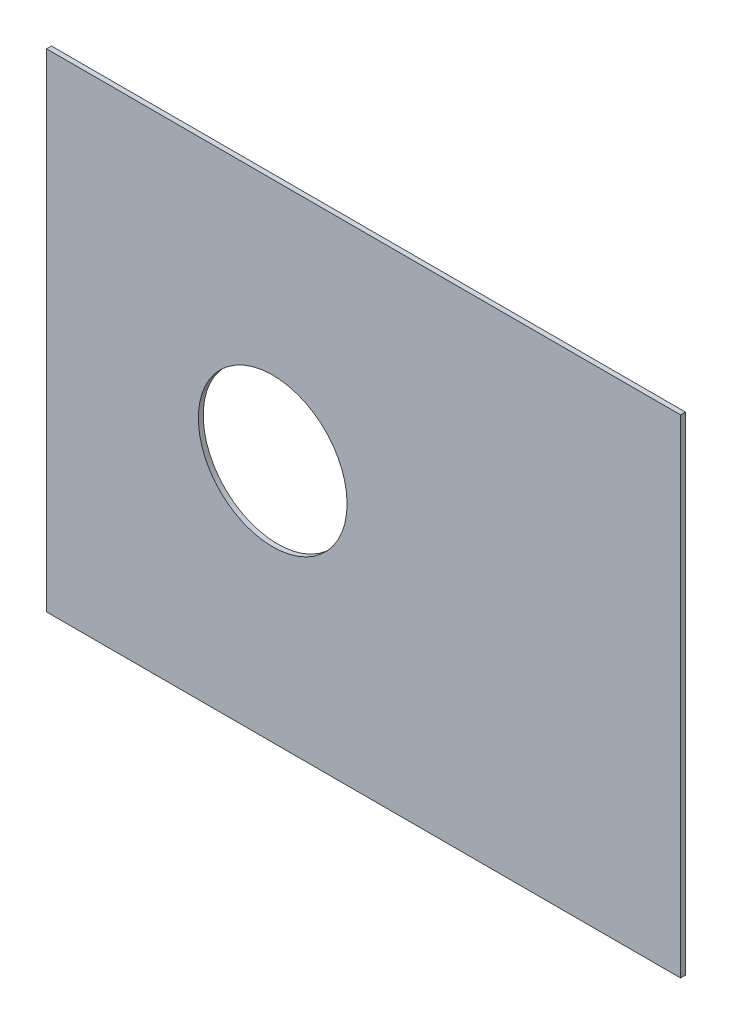
ISO-10303-21;
HEADER;
FILE_DESCRIPTION(('STEP AP214'),'2;1');
FILE_NAME('part.step','',(''),(''),'','','');
FILE_SCHEMA(('AUTOMOTIVE_DESIGN { 1 0 10303 214 1 1 1 1 }'));
ENDSEC;
DATA;
#1=APPLICATION_CONTEXT('core data for automotive mechanical design processes');
#2=APPLICATION_PROTOCOL_DEFINITION('international standard','automotive_design',2000,#1);
#3=PRODUCT_CONTEXT('',#1,'mechanical');
#4=PRODUCT('Part','Part','',(#3));
#5=PRODUCT_RELATED_PRODUCT_CATEGORY('part','',(#4));
#6=PRODUCT_DEFINITION_FORMATION('','',#4);
#7=PRODUCT_DEFINITION_CONTEXT('part definition',#1,'design');
#8=PRODUCT_DEFINITION('design','',#6,#7);
#9=PRODUCT_DEFINITION_SHAPE('','',#8);
#10=(LENGTH_UNIT() NAMED_UNIT(*) SI_UNIT(.MILLI.,.METRE.));
#11=(NAMED_UNIT(*) PLANE_ANGLE_UNIT() SI_UNIT($,.RADIAN.));
#12=(NAMED_UNIT(*) SI_UNIT($,.STERADIAN.) SOLID_ANGLE_UNIT());
#13=UNCERTAINTY_MEASURE_WITH_UNIT(LENGTH_MEASURE(1.E-05),#10,'distance_accuracy_value','');
#14=(GEOMETRIC_REPRESENTATION_CONTEXT(3) GLOBAL_UNCERTAINTY_ASSIGNED_CONTEXT((#13)) GLOBAL_UNIT_ASSIGNED_CONTEXT((#10,
#11,#12)) REPRESENTATION_CONTEXT('',''));
#15=CARTESIAN_POINT('',(0.,0.,0.));
#16=DIRECTION('',(0.,0.,1.));
#17=DIRECTION('',(1.,0.,0.));
#18=AXIS2_PLACEMENT_3D('',#15,#16,#17);
#19=CARTESIAN_POINT('',(0.,0.,2.));
#20=DIRECTION('',(0.,0.,-1.));
#21=DIRECTION('',(-1.,0.,0.));
#22=AXIS2_PLACEMENT_3D('',#19,#20,#21);
#23=PLANE('',#22);
#24=DIRECTION('',(0.,-1.,0.));
#25=VECTOR('',#24,1.);
#26=CARTESIAN_POINT('',(-130.,100.,2.));
#27=LINE('',#26,#25);
#28=CARTESIAN_POINT('',(-130.,100.,2.));
#29=VERTEX_POINT('',#28);
#30=CARTESIAN_POINT('',(-130.,-100.,2.));
#31=VERTEX_POINT('',#30);
#32=EDGE_CURVE('E92',#29,#31,#27,.T.);
#33=ORIENTED_EDGE('',*,*,#32,.T.);
#34=DIRECTION('',(1.,0.,0.));
#35=VECTOR('',#34,1.);
#36=CARTESIAN_POINT('',(130.,-100.,2.));
#37=LINE('',#36,#35);
#38=CARTESIAN_POINT('',(130.,-100.,2.));
#39=VERTEX_POINT('',#38);
#40=EDGE_CURVE('E87',#31,#39,#37,.T.);
#41=ORIENTED_EDGE('',*,*,#40,.T.);
#42=DIRECTION('',(0.,1.,0.));
#43=VECTOR('',#42,1.);
#44=CARTESIAN_POINT('',(130.,100.,2.));
#45=LINE('',#44,#43);
#46=CARTESIAN_POINT('',(130.,100.,2.));
#47=VERTEX_POINT('',#46);
#48=EDGE_CURVE('E90',#39,#47,#45,.T.);
#49=ORIENTED_EDGE('',*,*,#48,.T.);
#50=DIRECTION('',(-1.,0.,0.));
#51=VECTOR('',#50,1.);
#52=CARTESIAN_POINT('',(130.,100.,2.));
#53=LINE('',#52,#51);
#54=EDGE_CURVE('E57',#47,#29,#53,.T.);
#55=ORIENTED_EDGE('',*,*,#54,.T.);
#56=EDGE_LOOP('',(#33,#41,#49,#55));
#57=FACE_BOUND('',#56,.T.);
#58=CARTESIAN_POINT('',(-37.2600000000001,0.,2.));
#59=DIRECTION('',(0.,0.,1.));
#60=DIRECTION('',(1.,0.,0.));
#61=AXIS2_PLACEMENT_3D('',#58,#59,#60);
#62=CIRCLE('',#61,30.5);
#63=CARTESIAN_POINT('',(-6.76000000000006,0.,2.));
#64=VERTEX_POINT('',#63);
#65=EDGE_CURVE('E107',#64,#64,#62,.T.);
#66=ORIENTED_EDGE('',*,*,#65,.F.);
#67=EDGE_LOOP('',(#66));
#68=FACE_BOUND('',#67,.T.);
#69=ADVANCED_FACE('F40',(#57,#68),#23,.F.);
#70=CARTESIAN_POINT('',(0.,0.,0.));
#71=DIRECTION('',(0.,0.,-1.));
#72=DIRECTION('',(-1.,0.,0.));
#73=AXIS2_PLACEMENT_3D('',#70,#71,#72);
#74=PLANE('',#73);
#75=DIRECTION('',(0.,-1.,0.));
#76=VECTOR('',#75,1.);
#77=CARTESIAN_POINT('',(-130.,100.,0.));
#78=LINE('',#77,#76);
#79=CARTESIAN_POINT('',(-130.,100.,0.));
#80=VERTEX_POINT('',#79);
#81=CARTESIAN_POINT('',(-130.,-100.,0.));
#82=VERTEX_POINT('',#81);
#83=EDGE_CURVE('E104',#80,#82,#78,.T.);
#84=ORIENTED_EDGE('',*,*,#83,.F.);
#85=DIRECTION('',(-1.,0.,0.));
#86=VECTOR('',#85,1.);
#87=CARTESIAN_POINT('',(130.,100.,0.));
#88=LINE('',#87,#86);
#89=CARTESIAN_POINT('',(130.,100.,0.));
#90=VERTEX_POINT('',#89);
#91=EDGE_CURVE('E80',#90,#80,#88,.T.);
#92=ORIENTED_EDGE('',*,*,#91,.F.);
#93=DIRECTION('',(0.,1.,0.));
#94=VECTOR('',#93,1.);
#95=CARTESIAN_POINT('',(130.,100.,0.));
#96=LINE('',#95,#94);
#97=CARTESIAN_POINT('',(130.,-100.,0.));
#98=VERTEX_POINT('',#97);
#99=EDGE_CURVE('E74',#98,#90,#96,.T.);
#100=ORIENTED_EDGE('',*,*,#99,.F.);
#101=DIRECTION('',(1.,0.,0.));
#102=VECTOR('',#101,1.);
#103=CARTESIAN_POINT('',(130.,-100.,0.));
#104=LINE('',#103,#102);
#105=EDGE_CURVE('E96',#82,#98,#104,.T.);
#106=ORIENTED_EDGE('',*,*,#105,.F.);
#107=EDGE_LOOP('',(#84,#92,#100,#106));
#108=FACE_BOUND('',#107,.T.);
#109=CARTESIAN_POINT('',(-37.2600000000001,0.,0.));
#110=DIRECTION('',(0.,0.,1.));
#111=DIRECTION('',(1.,0.,0.));
#112=AXIS2_PLACEMENT_3D('',#109,#110,#111);
#113=CIRCLE('',#112,30.5);
#114=CARTESIAN_POINT('',(-6.76000000000006,0.,0.));
#115=VERTEX_POINT('',#114);
#116=EDGE_CURVE('E119',#115,#115,#113,.T.);
#117=ORIENTED_EDGE('',*,*,#116,.T.);
#118=EDGE_LOOP('',(#117));
#119=FACE_BOUND('',#118,.T.);
#120=ADVANCED_FACE('F115',(#108,#119),#74,.T.);
#121=CARTESIAN_POINT('',(-130.,100.,2.));
#122=DIRECTION('',(1.,0.,0.));
#123=DIRECTION('',(0.,1.,0.));
#124=AXIS2_PLACEMENT_3D('',#121,#122,#123);
#125=PLANE('',#124);
#126=ORIENTED_EDGE('',*,*,#83,.T.);
#127=DIRECTION('',(0.,0.,-1.));
#128=VECTOR('',#127,1.);
#129=CARTESIAN_POINT('',(-130.,-100.,2.));
#130=LINE('',#129,#128);
#131=EDGE_CURVE('E11',#31,#82,#130,.T.);
#132=ORIENTED_EDGE('',*,*,#131,.F.);
#133=ORIENTED_EDGE('',*,*,#32,.F.);
#134=DIRECTION('',(0.,0.,-1.));
#135=VECTOR('',#134,1.);
#136=CARTESIAN_POINT('',(-130.,100.,2.));
#137=LINE('',#136,#135);
#138=EDGE_CURVE('E100',#29,#80,#137,.T.);
#139=ORIENTED_EDGE('',*,*,#138,.T.);
#140=EDGE_LOOP('',(#126,#132,#133,#139));
#141=FACE_BOUND('',#140,.T.);
#142=ADVANCED_FACE('F42',(#141),#125,.F.);
#143=CARTESIAN_POINT('',(130.,-100.,2.));
#144=DIRECTION('',(0.,1.,0.));
#145=DIRECTION('',(-1.,0.,0.));
#146=AXIS2_PLACEMENT_3D('',#143,#144,#145);
#147=PLANE('',#146);
#148=ORIENTED_EDGE('',*,*,#105,.T.);
#149=DIRECTION('',(0.,0.,-1.));
#150=VECTOR('',#149,1.);
#151=CARTESIAN_POINT('',(130.,-100.,2.));
#152=LINE('',#151,#150);
#153=EDGE_CURVE('E49',#39,#98,#152,.T.);
#154=ORIENTED_EDGE('',*,*,#153,.F.);
#155=ORIENTED_EDGE('',*,*,#40,.F.);
#156=ORIENTED_EDGE('',*,*,#131,.T.);
#157=EDGE_LOOP('',(#148,#154,#155,#156));
#158=FACE_BOUND('',#157,.T.);
#159=ADVANCED_FACE('F95',(#158),#147,.F.);
#160=CARTESIAN_POINT('',(130.,100.,2.));
#161=DIRECTION('',(-1.,0.,0.));
#162=DIRECTION('',(0.,-1.,0.));
#163=AXIS2_PLACEMENT_3D('',#160,#161,#162);
#164=PLANE('',#163);
#165=ORIENTED_EDGE('',*,*,#99,.T.);
#166=DIRECTION('',(0.,0.,-1.));
#167=VECTOR('',#166,1.);
#168=CARTESIAN_POINT('',(130.,100.,2.));
#169=LINE('',#168,#167);
#170=EDGE_CURVE('E97',#47,#90,#169,.T.);
#171=ORIENTED_EDGE('',*,*,#170,.F.);
#172=ORIENTED_EDGE('',*,*,#48,.F.);
#173=ORIENTED_EDGE('',*,*,#153,.T.);
#174=EDGE_LOOP('',(#165,#171,#172,#173));
#175=FACE_BOUND('',#174,.T.);
#176=ADVANCED_FACE('F98',(#175),#164,.F.);
#177=CARTESIAN_POINT('',(130.,100.,2.));
#178=DIRECTION('',(0.,-1.,0.));
#179=DIRECTION('',(1.,0.,0.));
#180=AXIS2_PLACEMENT_3D('',#177,#178,#179);
#181=PLANE('',#180);
#182=ORIENTED_EDGE('',*,*,#91,.T.);
#183=ORIENTED_EDGE('',*,*,#138,.F.);
#184=ORIENTED_EDGE('',*,*,#54,.F.);
#185=ORIENTED_EDGE('',*,*,#170,.T.);
#186=EDGE_LOOP('',(#182,#183,#184,#185));
#187=FACE_BOUND('',#186,.T.);
#188=ADVANCED_FACE('F112',(#187),#181,.F.);
#189=CARTESIAN_POINT('',(-37.2600000000001,0.,2.));
#190=DIRECTION('',(0.,0.,-1.));
#191=DIRECTION('',(-1.,0.,0.));
#192=AXIS2_PLACEMENT_3D('',#189,#190,#191);
#193=CYLINDRICAL_SURFACE('',#192,30.5);
#194=ORIENTED_EDGE('',*,*,#65,.T.);
#195=EDGE_LOOP('',(#194));
#196=FACE_BOUND('',#195,.T.);
#197=ORIENTED_EDGE('',*,*,#116,.F.);
#198=EDGE_LOOP('',(#197));
#199=FACE_BOUND('',#198,.T.);
#200=ADVANCED_FACE('F125',(#196,#199),#193,.F.);
#201=CLOSED_SHELL('',(#69,#120,#142,#159,#176,#188,#200));
#202=MANIFOLD_SOLID_BREP('B2',#201);
#203=ADVANCED_BREP_SHAPE_REPRESENTATION('',(#18,#202),#14);
#204=SHAPE_DEFINITION_REPRESENTATION(#9,#203);
ENDSEC;
END-ISO-10303-21;
